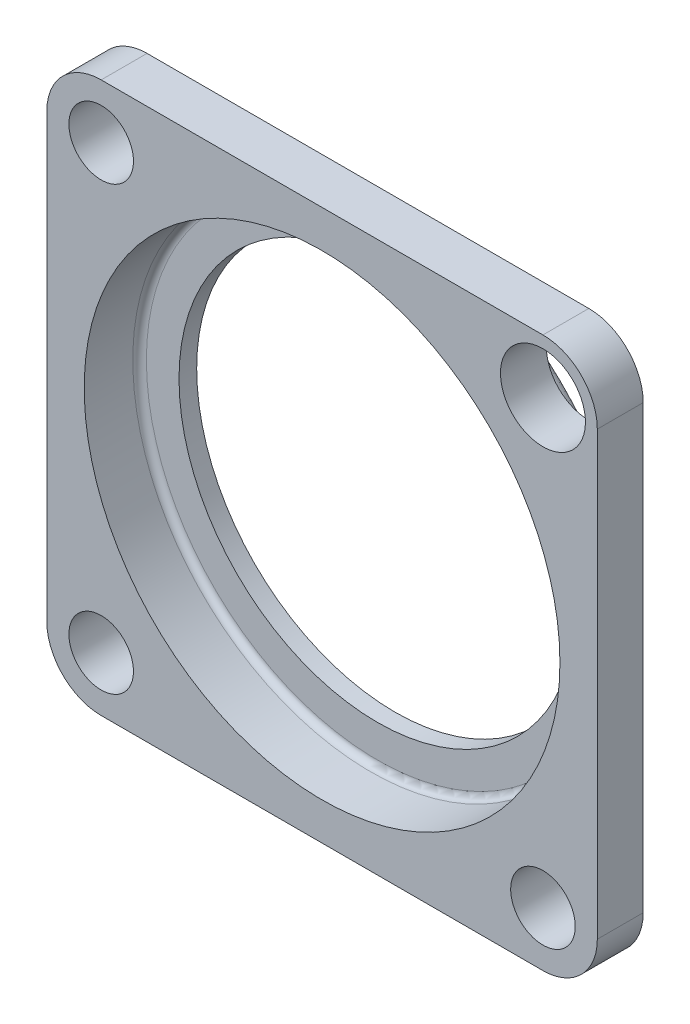
ISO-10303-21;
HEADER;
FILE_DESCRIPTION(('STEP AP214'),'2;1');
FILE_NAME('part.step','',(''),(''),'','','');
FILE_SCHEMA(('AUTOMOTIVE_DESIGN { 1 0 10303 214 1 1 1 1 }'));
ENDSEC;
DATA;
#1=APPLICATION_CONTEXT('core data for automotive mechanical design processes');
#2=APPLICATION_PROTOCOL_DEFINITION('international standard','automotive_design',2000,#1);
#3=PRODUCT_CONTEXT('',#1,'mechanical');
#4=PRODUCT('Part','Part','',(#3));
#5=PRODUCT_RELATED_PRODUCT_CATEGORY('part','',(#4));
#6=PRODUCT_DEFINITION_FORMATION('','',#4);
#7=PRODUCT_DEFINITION_CONTEXT('part definition',#1,'design');
#8=PRODUCT_DEFINITION('design','',#6,#7);
#9=PRODUCT_DEFINITION_SHAPE('','',#8);
#10=(LENGTH_UNIT() NAMED_UNIT(*) SI_UNIT(.MILLI.,.METRE.));
#11=(NAMED_UNIT(*) PLANE_ANGLE_UNIT() SI_UNIT($,.RADIAN.));
#12=(NAMED_UNIT(*) SI_UNIT($,.STERADIAN.) SOLID_ANGLE_UNIT());
#13=UNCERTAINTY_MEASURE_WITH_UNIT(LENGTH_MEASURE(1.E-05),#10,'distance_accuracy_value','');
#14=(GEOMETRIC_REPRESENTATION_CONTEXT(3) GLOBAL_UNCERTAINTY_ASSIGNED_CONTEXT((#13)) GLOBAL_UNIT_ASSIGNED_CONTEXT((#10,
#11,#12)) REPRESENTATION_CONTEXT('',''));
#15=CARTESIAN_POINT('',(0.,0.,0.));
#16=DIRECTION('',(0.,0.,1.));
#17=DIRECTION('',(1.,0.,0.));
#18=AXIS2_PLACEMENT_3D('',#15,#16,#17);
#19=CARTESIAN_POINT('',(-0.00259371394449204,0.00320343713926974,-389.399623049439));
#20=DIRECTION('',(0.,0.,-1.));
#21=DIRECTION('',(0.,-1.,0.));
#22=AXIS2_PLACEMENT_3D('',#19,#20,#21);
#23=PLANE('',#22);
#24=CARTESIAN_POINT('',(0.,0.,-389.399623049439));
#25=DIRECTION('',(0.,0.,-1.));
#26=DIRECTION('',(-1.,0.,0.));
#27=AXIS2_PLACEMENT_3D('',#24,#25,#26);
#28=CIRCLE('',#27,70.);
#29=CARTESIAN_POINT('',(70.,0.,-389.399623049439));
#30=VERTEX_POINT('',#29);
#31=EDGE_CURVE('E201',#30,#30,#28,.T.);
#32=ORIENTED_EDGE('',*,*,#31,.T.);
#33=EDGE_LOOP('',(#32));
#34=FACE_BOUND('',#33,.T.);
#35=CARTESIAN_POINT('',(64.9980541664548,-64.9961486760095,-389.399623049447));
#36=DIRECTION('',(-1.27309946439277E-13,0.,-1.));
#37=DIRECTION('',(9.96744036330944E-06,-0.999999999950325,0.));
#38=AXIS2_PLACEMENT_3D('',#35,#36,#37);
#39=CIRCLE('',#38,9.5);
#40=CARTESIAN_POINT('',(64.9979594757696,-55.4961486764813,-389.399623049446));
#41=VERTEX_POINT('',#40);
#42=EDGE_CURVE('E263',#41,#41,#39,.T.);
#43=ORIENTED_EDGE('',*,*,#42,.T.);
#44=EDGE_LOOP('',(#43));
#45=FACE_BOUND('',#44,.T.);
#46=CARTESIAN_POINT('',(-65.0019458270874,-64.9974444432576,-389.399623049431));
#47=DIRECTION('',(-1.27309946439277E-13,0.,-1.));
#48=DIRECTION('',(9.96744036330944E-06,-0.999999999950325,0.));
#49=AXIS2_PLACEMENT_3D('',#46,#47,#48);
#50=CIRCLE('',#49,9.5);
#51=CARTESIAN_POINT('',(-65.0020405177726,-55.4974444437295,-389.39962304943));
#52=VERTEX_POINT('',#51);
#53=EDGE_CURVE('E252',#52,#52,#50,.T.);
#54=ORIENTED_EDGE('',*,*,#53,.T.);
#55=EDGE_LOOP('',(#54));
#56=FACE_BOUND('',#55,.T.);
#57=CARTESIAN_POINT('',(-65.0032415943344,65.0025555502847,-389.399623049429));
#58=DIRECTION('',(-1.27309946439277E-13,0.,-1.));
#59=DIRECTION('',(9.96744036330944E-06,-0.999999999950325,0.));
#60=AXIS2_PLACEMENT_3D('',#57,#58,#59);
#61=CIRCLE('',#60,9.5);
#62=CARTESIAN_POINT('',(-65.0033362850196,74.5025555498128,-389.399623049429));
#63=VERTEX_POINT('',#62);
#64=EDGE_CURVE('E239',#63,#63,#61,.T.);
#65=ORIENTED_EDGE('',*,*,#64,.T.);
#66=EDGE_LOOP('',(#65));
#67=FACE_BOUND('',#66,.T.);
#68=CARTESIAN_POINT('',(64.9967583992076,65.0038513175325,-389.399623049447));
#69=DIRECTION('',(-1.27309946439219E-13,0.,-1.));
#70=DIRECTION('',(9.96744036336768E-06,-0.999999999950325,0.));
#71=AXIS2_PLACEMENT_3D('',#68,#69,#70);
#72=CIRCLE('',#71,12.5);
#73=CARTESIAN_POINT('',(64.9966338062013,77.5038513169116,-389.399623049446));
#74=VERTEX_POINT('',#73);
#75=EDGE_CURVE('E193',#74,#74,#72,.T.);
#76=ORIENTED_EDGE('',*,*,#75,.T.);
#77=EDGE_LOOP('',(#76));
#78=FACE_BOUND('',#77,.T.);
#79=DIRECTION('',(9.96744036217376E-06,-0.999999999950325,0.));
#80=VECTOR('',#79,1.);
#81=CARTESIAN_POINT('',(-81.0019458262971,-64.9976039223009,-389.399623049439));
#82=LINE('',#81,#80);
#83=CARTESIAN_POINT('',(-81.0032415935442,65.0023960712406,-389.399623049439));
#84=VERTEX_POINT('',#83);
#85=CARTESIAN_POINT('',(-81.0019458262971,-64.9976039223009,-389.399623049439));
#86=VERTEX_POINT('',#85);
#87=EDGE_CURVE('E11',#84,#86,#82,.T.);
#88=ORIENTED_EDGE('',*,*,#87,.T.);
#89=CARTESIAN_POINT('',(-65.0019458270918,-64.9974444432564,-389.399623049439));
#90=DIRECTION('',(0.,0.,1.));
#91=DIRECTION('',(0.662435719443942,-0.749118760681367,0.));
#92=AXIS2_PLACEMENT_3D('',#89,#90,#91);
#93=CIRCLE('',#92,15.9999999999982);
#94=CARTESIAN_POINT('',(-65.0017863480461,-80.9974444424598,-389.399623049439));
#95=VERTEX_POINT('',#94);
#96=EDGE_CURVE('E338',#86,#95,#93,.T.);
#97=ORIENTED_EDGE('',*,*,#96,.T.);
#98=DIRECTION('',(0.999999999950325,9.96744035930419E-06,0.));
#99=VECTOR('',#98,1.);
#100=CARTESIAN_POINT('',(64.9982136454962,-80.9961486752138,-389.399623049439));
#101=LINE('',#100,#99);
#102=CARTESIAN_POINT('',(64.9982136454962,-80.9961486752138,-389.399623049439));
#103=VERTEX_POINT('',#102);
#104=EDGE_CURVE('E318',#95,#103,#101,.T.);
#105=ORIENTED_EDGE('',*,*,#104,.T.);
#106=CARTESIAN_POINT('',(64.9980541664502,-64.9961486760083,-389.399623049439));
#107=DIRECTION('',(0.,0.,1.));
#108=DIRECTION('',(0.999999999950325,9.96744036863008E-06,0.));
#109=AXIS2_PLACEMENT_3D('',#106,#107,#108);
#110=CIRCLE('',#109,16.);
#111=CARTESIAN_POINT('',(80.9980541656554,-64.9959891969624,-389.399623049439));
#112=VERTEX_POINT('',#111);
#113=EDGE_CURVE('E319',#103,#112,#110,.T.);
#114=ORIENTED_EDGE('',*,*,#113,.T.);
#115=DIRECTION('',(-9.96744036217369E-06,0.999999999950325,0.));
#116=VECTOR('',#115,1.);
#117=CARTESIAN_POINT('',(80.9967583984083,65.0040107965791,-389.399623049439));
#118=LINE('',#117,#116);
#119=CARTESIAN_POINT('',(80.9967583984083,65.0040107965791,-389.399623049439));
#120=VERTEX_POINT('',#119);
#121=EDGE_CURVE('E219',#112,#120,#118,.T.);
#122=ORIENTED_EDGE('',*,*,#121,.T.);
#123=CARTESIAN_POINT('',(64.996758399203,65.0038513175332,-389.399623049439));
#124=DIRECTION('',(0.,0.,1.));
#125=DIRECTION('',(-9.96744036585451E-06,0.999999999950325,0.));
#126=AXIS2_PLACEMENT_3D('',#123,#124,#125);
#127=CIRCLE('',#126,16.);
#128=CARTESIAN_POINT('',(64.9965989201572,81.0038513167384,-389.399623049439));
#129=VERTEX_POINT('',#128);
#130=EDGE_CURVE('E245',#120,#129,#127,.T.);
#131=ORIENTED_EDGE('',*,*,#130,.T.);
#132=DIRECTION('',(-0.999999999950325,-9.9674403614905E-06,0.));
#133=VECTOR('',#132,1.);
#134=CARTESIAN_POINT('',(-65.0034010733849,81.0025555494914,-389.399623049439));
#135=LINE('',#134,#133);
#136=CARTESIAN_POINT('',(-65.003401073385,81.0025555494911,-389.399623049439));
#137=VERTEX_POINT('',#136);
#138=EDGE_CURVE('E293',#129,#137,#135,.T.);
#139=ORIENTED_EDGE('',*,*,#138,.T.);
#140=CARTESIAN_POINT('',(-65.0032415943392,65.0025555502859,-389.399623049439));
#141=DIRECTION('',(0.,0.,1.));
#142=DIRECTION('',(-0.999999999950325,-9.96744036196874E-06,0.));
#143=AXIS2_PLACEMENT_3D('',#140,#141,#142);
#144=CIRCLE('',#143,16.);
#145=EDGE_CURVE('E277',#137,#84,#144,.T.);
#146=ORIENTED_EDGE('',*,*,#145,.T.);
#147=EDGE_LOOP('',(#88,#97,#105,#114,#122,#131,#139,#146));
#148=FACE_BOUND('',#147,.T.);
#149=ADVANCED_FACE('F17',(#34,#45,#56,#67,#78,#148),#23,.F.);
#150=CARTESIAN_POINT('',(-0.00259371394449204,0.00320343713926974,-402.899623049439));
#151=DIRECTION('',(0.,0.,-1.));
#152=DIRECTION('',(0.,-1.,0.));
#153=AXIS2_PLACEMENT_3D('',#150,#151,#152);
#154=PLANE('',#153);
#155=CARTESIAN_POINT('',(64.9980541664513,-64.9961486760094,-402.899623049447));
#156=DIRECTION('',(-1.27309946439277E-13,0.,-1.));
#157=DIRECTION('',(9.96744036330944E-06,-0.999999999950325,0.));
#158=AXIS2_PLACEMENT_3D('',#155,#156,#157);
#159=CIRCLE('',#158,9.5);
#160=CARTESIAN_POINT('',(64.9979594757679,-55.4961486764813,-402.899623049447));
#161=VERTEX_POINT('',#160);
#162=EDGE_CURVE('E271',#161,#161,#159,.T.);
#163=ORIENTED_EDGE('',*,*,#162,.F.);
#164=EDGE_LOOP('',(#163));
#165=FACE_BOUND('',#164,.T.);
#166=CARTESIAN_POINT('',(-65.0019458270909,-64.9974444432576,-402.899623049431));
#167=DIRECTION('',(-1.27309946439277E-13,0.,-1.));
#168=DIRECTION('',(9.96744036330944E-06,-0.999999999950325,0.));
#169=AXIS2_PLACEMENT_3D('',#166,#167,#168);
#170=CIRCLE('',#169,9.5);
#171=CARTESIAN_POINT('',(-65.0020405177743,-55.4974444437295,-402.899623049431));
#172=VERTEX_POINT('',#171);
#173=EDGE_CURVE('E260',#172,#172,#170,.T.);
#174=ORIENTED_EDGE('',*,*,#173,.F.);
#175=EDGE_LOOP('',(#174));
#176=FACE_BOUND('',#175,.T.);
#177=CARTESIAN_POINT('',(-65.0032415943379,65.0025555502847,-402.899623049429));
#178=DIRECTION('',(-1.27309946439277E-13,0.,-1.));
#179=DIRECTION('',(9.96744036330944E-06,-0.999999999950325,0.));
#180=AXIS2_PLACEMENT_3D('',#177,#178,#179);
#181=CIRCLE('',#180,9.5);
#182=CARTESIAN_POINT('',(-65.0033362850213,74.5025555498128,-402.899623049429));
#183=VERTEX_POINT('',#182);
#184=EDGE_CURVE('E244',#183,#183,#181,.T.);
#185=ORIENTED_EDGE('',*,*,#184,.F.);
#186=EDGE_LOOP('',(#185));
#187=FACE_BOUND('',#186,.T.);
#188=CARTESIAN_POINT('',(64.9967583992041,65.0038513175326,-402.899623049447));
#189=DIRECTION('',(1.27309946439219E-13,0.,1.));
#190=DIRECTION('',(9.96744036336768E-06,-0.999999999950325,0.));
#191=AXIS2_PLACEMENT_3D('',#188,#189,#190);
#192=CIRCLE('',#191,12.5);
#193=CARTESIAN_POINT('',(64.9966338061996,77.5038513169117,-402.899623049447));
#194=VERTEX_POINT('',#193);
#195=EDGE_CURVE('E236',#194,#194,#192,.T.);
#196=ORIENTED_EDGE('',*,*,#195,.T.);
#197=EDGE_LOOP('',(#196));
#198=FACE_BOUND('',#197,.T.);
#199=CARTESIAN_POINT('',(0.,0.,-402.899623049439));
#200=DIRECTION('',(0.,0.,1.));
#201=DIRECTION('',(0.,1.,0.));
#202=AXIS2_PLACEMENT_3D('',#199,#200,#201);
#203=CIRCLE('',#202,72.0027639147435);
#204=CARTESIAN_POINT('',(0.,-72.0027639147435,-402.899623049439));
#205=VERTEX_POINT('',#204);
#206=EDGE_CURVE('E210',#205,#205,#203,.T.);
#207=ORIENTED_EDGE('',*,*,#206,.T.);
#208=EDGE_LOOP('',(#207));
#209=FACE_BOUND('',#208,.T.);
#210=DIRECTION('',(-9.96744036217376E-06,0.999999999950325,0.));
#211=VECTOR('',#210,1.);
#212=CARTESIAN_POINT('',(-81.0019458262971,-64.9976039223009,-402.899623049439));
#213=LINE('',#212,#211);
#214=CARTESIAN_POINT('',(-81.0019458262971,-64.9976039223009,-402.899623049439));
#215=VERTEX_POINT('',#214);
#216=CARTESIAN_POINT('',(-81.0032415935442,65.0023960712406,-402.899623049439));
#217=VERTEX_POINT('',#216);
#218=EDGE_CURVE('E26',#215,#217,#213,.T.);
#219=ORIENTED_EDGE('',*,*,#218,.T.);
#220=CARTESIAN_POINT('',(-65.0032415943392,65.0025555502859,-402.899623049439));
#221=DIRECTION('',(0.,0.,-1.));
#222=DIRECTION('',(-0.999999999950325,-9.96744036196874E-06,0.));
#223=AXIS2_PLACEMENT_3D('',#220,#221,#222);
#224=CIRCLE('',#223,16.);
#225=CARTESIAN_POINT('',(-65.003401073385,81.0025555494911,-402.899623049439));
#226=VERTEX_POINT('',#225);
#227=EDGE_CURVE('E280',#217,#226,#224,.T.);
#228=ORIENTED_EDGE('',*,*,#227,.T.);
#229=DIRECTION('',(0.999999999950325,9.9674403614905E-06,0.));
#230=VECTOR('',#229,1.);
#231=CARTESIAN_POINT('',(-65.0034010733849,81.0025555494914,-402.899623049439));
#232=LINE('',#231,#230);
#233=CARTESIAN_POINT('',(64.9965989201572,81.0038513167384,-402.899623049439));
#234=VERTEX_POINT('',#233);
#235=EDGE_CURVE('E276',#226,#234,#232,.T.);
#236=ORIENTED_EDGE('',*,*,#235,.T.);
#237=CARTESIAN_POINT('',(64.996758399203,65.0038513175332,-402.899623049439));
#238=DIRECTION('',(0.,0.,-1.));
#239=DIRECTION('',(-9.96744036585451E-06,0.999999999950325,0.));
#240=AXIS2_PLACEMENT_3D('',#237,#238,#239);
#241=CIRCLE('',#240,16.);
#242=CARTESIAN_POINT('',(80.9967583984083,65.0040107965791,-402.899623049439));
#243=VERTEX_POINT('',#242);
#244=EDGE_CURVE('E249',#234,#243,#241,.T.);
#245=ORIENTED_EDGE('',*,*,#244,.T.);
#246=DIRECTION('',(9.96744036217369E-06,-0.999999999950325,0.));
#247=VECTOR('',#246,1.);
#248=CARTESIAN_POINT('',(80.9967583984083,65.0040107965791,-402.899623049439));
#249=LINE('',#248,#247);
#250=CARTESIAN_POINT('',(80.9980541656554,-64.9959891969624,-402.899623049439));
#251=VERTEX_POINT('',#250);
#252=EDGE_CURVE('E223',#243,#251,#249,.T.);
#253=ORIENTED_EDGE('',*,*,#252,.T.);
#254=CARTESIAN_POINT('',(64.9980541664502,-64.9961486760083,-402.899623049439));
#255=DIRECTION('',(0.,0.,-1.));
#256=DIRECTION('',(0.999999999950325,9.96744036863008E-06,0.));
#257=AXIS2_PLACEMENT_3D('',#254,#255,#256);
#258=CIRCLE('',#257,16.);
#259=CARTESIAN_POINT('',(64.9982136454962,-80.9961486752138,-402.899623049439));
#260=VERTEX_POINT('',#259);
#261=EDGE_CURVE('E312',#251,#260,#258,.T.);
#262=ORIENTED_EDGE('',*,*,#261,.T.);
#263=DIRECTION('',(-0.999999999950325,-9.96744035930419E-06,0.));
#264=VECTOR('',#263,1.);
#265=CARTESIAN_POINT('',(64.9982136454962,-80.9961486752138,-402.899623049439));
#266=LINE('',#265,#264);
#267=CARTESIAN_POINT('',(-65.0017863480462,-80.9974444424598,-402.899623049439));
#268=VERTEX_POINT('',#267);
#269=EDGE_CURVE('E329',#260,#268,#266,.T.);
#270=ORIENTED_EDGE('',*,*,#269,.T.);
#271=CARTESIAN_POINT('',(-65.0019458270918,-64.9974444432564,-402.899623049439));
#272=DIRECTION('',(0.,0.,-1.));
#273=DIRECTION('',(0.662435719443942,-0.749118760681367,0.));
#274=AXIS2_PLACEMENT_3D('',#271,#272,#273);
#275=CIRCLE('',#274,15.9999999999982);
#276=EDGE_CURVE('E317',#268,#215,#275,.T.);
#277=ORIENTED_EDGE('',*,*,#276,.T.);
#278=EDGE_LOOP('',(#219,#228,#236,#245,#253,#262,#270,#277));
#279=FACE_BOUND('',#278,.T.);
#280=ADVANCED_FACE('F19',(#165,#176,#187,#198,#209,#279),#154,.T.);
#281=CARTESIAN_POINT('',(-81.0032415935442,65.0023960712406,-402.899623049439));
#282=DIRECTION('',(-0.999999999950325,-9.96744036217376E-06,0.));
#283=DIRECTION('',(-9.96744036217376E-06,0.999999999950325,0.));
#284=AXIS2_PLACEMENT_3D('',#281,#282,#283);
#285=PLANE('',#284);
#286=ORIENTED_EDGE('',*,*,#218,.F.);
#287=DIRECTION('',(0.,0.,1.));
#288=VECTOR('',#287,1.);
#289=CARTESIAN_POINT('',(-81.0019458262971,-64.9976039223009,-402.899623049439));
#290=LINE('',#289,#288);
#291=EDGE_CURVE('E341',#215,#86,#290,.T.);
#292=ORIENTED_EDGE('',*,*,#291,.T.);
#293=ORIENTED_EDGE('',*,*,#87,.F.);
#294=DIRECTION('',(0.,0.,1.));
#295=VECTOR('',#294,1.);
#296=CARTESIAN_POINT('',(-81.0032415935442,65.0023960712406,-402.899623049439));
#297=LINE('',#296,#295);
#298=EDGE_CURVE('E284',#217,#84,#297,.T.);
#299=ORIENTED_EDGE('',*,*,#298,.F.);
#300=EDGE_LOOP('',(#286,#292,#293,#299));
#301=FACE_BOUND('',#300,.T.);
#302=ADVANCED_FACE('F347',(#301),#285,.T.);
#303=CARTESIAN_POINT('',(-65.0019458270918,-64.9974444432564,-402.899623049439));
#304=DIRECTION('',(0.,0.,1.));
#305=DIRECTION('',(0.662435719443942,-0.749118760681367,0.));
#306=AXIS2_PLACEMENT_3D('',#303,#304,#305);
#307=CYLINDRICAL_SURFACE('',#306,15.9999999999982);
#308=ORIENTED_EDGE('',*,*,#276,.F.);
#309=DIRECTION('',(0.,0.,1.));
#310=VECTOR('',#309,1.);
#311=CARTESIAN_POINT('',(-65.0017863480462,-80.9974444424598,-402.899623049439));
#312=LINE('',#311,#310);
#313=EDGE_CURVE('E313',#268,#95,#312,.T.);
#314=ORIENTED_EDGE('',*,*,#313,.T.);
#315=ORIENTED_EDGE('',*,*,#96,.F.);
#316=ORIENTED_EDGE('',*,*,#291,.F.);
#317=EDGE_LOOP('',(#308,#314,#315,#316));
#318=FACE_BOUND('',#317,.T.);
#319=ADVANCED_FACE('F374',(#318),#307,.T.);
#320=CARTESIAN_POINT('',(-65.0017863480461,-80.9974444424605,-402.899623049439));
#321=DIRECTION('',(9.96744035930419E-06,-0.999999999950325,0.));
#322=DIRECTION('',(0.,0.,-1.));
#323=AXIS2_PLACEMENT_3D('',#320,#321,#322);
#324=PLANE('',#323);
#325=ORIENTED_EDGE('',*,*,#269,.F.);
#326=DIRECTION('',(0.,0.,1.));
#327=VECTOR('',#326,1.);
#328=CARTESIAN_POINT('',(64.9982136454962,-80.9961486752138,-402.899623049439));
#329=LINE('',#328,#327);
#330=EDGE_CURVE('E322',#260,#103,#329,.T.);
#331=ORIENTED_EDGE('',*,*,#330,.T.);
#332=ORIENTED_EDGE('',*,*,#104,.F.);
#333=ORIENTED_EDGE('',*,*,#313,.F.);
#334=EDGE_LOOP('',(#325,#331,#332,#333));
#335=FACE_BOUND('',#334,.T.);
#336=ADVANCED_FACE('F370',(#335),#324,.T.);
#337=CARTESIAN_POINT('',(64.9980541664502,-64.9961486760083,-402.899623049439));
#338=DIRECTION('',(0.,0.,1.));
#339=DIRECTION('',(0.999999999950325,9.96744036863008E-06,0.));
#340=AXIS2_PLACEMENT_3D('',#337,#338,#339);
#341=CYLINDRICAL_SURFACE('',#340,16.);
#342=ORIENTED_EDGE('',*,*,#261,.F.);
#343=DIRECTION('',(0.,0.,1.));
#344=VECTOR('',#343,1.);
#345=CARTESIAN_POINT('',(80.9980541656554,-64.9959891969624,-402.899623049439));
#346=LINE('',#345,#344);
#347=EDGE_CURVE('E222',#251,#112,#346,.T.);
#348=ORIENTED_EDGE('',*,*,#347,.T.);
#349=ORIENTED_EDGE('',*,*,#113,.F.);
#350=ORIENTED_EDGE('',*,*,#330,.F.);
#351=EDGE_LOOP('',(#342,#348,#349,#350));
#352=FACE_BOUND('',#351,.T.);
#353=ADVANCED_FACE('F366',(#352),#341,.T.);
#354=CARTESIAN_POINT('',(80.9980541656554,-64.9959891969624,-402.899623049439));
#355=DIRECTION('',(0.999999999950325,9.96744036217369E-06,0.));
#356=DIRECTION('',(0.,0.,-1.));
#357=AXIS2_PLACEMENT_3D('',#354,#355,#356);
#358=PLANE('',#357);
#359=ORIENTED_EDGE('',*,*,#252,.F.);
#360=DIRECTION('',(0.,0.,1.));
#361=VECTOR('',#360,1.);
#362=CARTESIAN_POINT('',(80.9967583984083,65.0040107965791,-402.899623049439));
#363=LINE('',#362,#361);
#364=EDGE_CURVE('E248',#243,#120,#363,.T.);
#365=ORIENTED_EDGE('',*,*,#364,.T.);
#366=ORIENTED_EDGE('',*,*,#121,.F.);
#367=ORIENTED_EDGE('',*,*,#347,.F.);
#368=EDGE_LOOP('',(#359,#365,#366,#367));
#369=FACE_BOUND('',#368,.T.);
#370=ADVANCED_FACE('F362',(#369),#358,.T.);
#371=CARTESIAN_POINT('',(64.996758399203,65.0038513175332,-402.899623049439));
#372=DIRECTION('',(0.,0.,1.));
#373=DIRECTION('',(-9.96744036585451E-06,0.999999999950325,0.));
#374=AXIS2_PLACEMENT_3D('',#371,#372,#373);
#375=CYLINDRICAL_SURFACE('',#374,16.);
#376=ORIENTED_EDGE('',*,*,#244,.F.);
#377=DIRECTION('',(0.,0.,1.));
#378=VECTOR('',#377,1.);
#379=CARTESIAN_POINT('',(64.9965989201572,81.0038513167384,-402.899623049439));
#380=LINE('',#379,#378);
#381=EDGE_CURVE('E296',#234,#129,#380,.T.);
#382=ORIENTED_EDGE('',*,*,#381,.T.);
#383=ORIENTED_EDGE('',*,*,#130,.F.);
#384=ORIENTED_EDGE('',*,*,#364,.F.);
#385=EDGE_LOOP('',(#376,#382,#383,#384));
#386=FACE_BOUND('',#385,.T.);
#387=ADVANCED_FACE('F358',(#386),#375,.T.);
#388=CARTESIAN_POINT('',(64.9965989201572,81.0038513167384,-402.899623049439));
#389=DIRECTION('',(-9.9674403614905E-06,0.999999999950325,0.));
#390=DIRECTION('',(0.,0.,1.));
#391=AXIS2_PLACEMENT_3D('',#388,#389,#390);
#392=PLANE('',#391);
#393=ORIENTED_EDGE('',*,*,#235,.F.);
#394=DIRECTION('',(0.,0.,1.));
#395=VECTOR('',#394,1.);
#396=CARTESIAN_POINT('',(-65.003401073385,81.0025555494911,-402.899623049439));
#397=LINE('',#396,#395);
#398=EDGE_CURVE('E272',#226,#137,#397,.T.);
#399=ORIENTED_EDGE('',*,*,#398,.T.);
#400=ORIENTED_EDGE('',*,*,#138,.F.);
#401=ORIENTED_EDGE('',*,*,#381,.F.);
#402=EDGE_LOOP('',(#393,#399,#400,#401));
#403=FACE_BOUND('',#402,.T.);
#404=ADVANCED_FACE('F354',(#403),#392,.T.);
#405=CARTESIAN_POINT('',(-65.0032415943392,65.0025555502859,-402.899623049439));
#406=DIRECTION('',(0.,0.,1.));
#407=DIRECTION('',(-0.999999999950325,-9.96744036196874E-06,0.));
#408=AXIS2_PLACEMENT_3D('',#405,#406,#407);
#409=CYLINDRICAL_SURFACE('',#408,16.);
#410=ORIENTED_EDGE('',*,*,#227,.F.);
#411=ORIENTED_EDGE('',*,*,#298,.T.);
#412=ORIENTED_EDGE('',*,*,#145,.F.);
#413=ORIENTED_EDGE('',*,*,#398,.F.);
#414=EDGE_LOOP('',(#410,#411,#412,#413));
#415=FACE_BOUND('',#414,.T.);
#416=ADVANCED_FACE('F351',(#415),#409,.T.);
#417=CARTESIAN_POINT('',(64.9980541664513,-64.9961486760094,-402.899623049447));
#418=DIRECTION('',(1.27305573490351E-13,0.,1.));
#419=DIRECTION('',(9.96744036330944E-06,-0.999999999950325,0.));
#420=AXIS2_PLACEMENT_3D('',#417,#418,#419);
#421=CYLINDRICAL_SURFACE('',#420,9.5);
#422=ORIENTED_EDGE('',*,*,#42,.F.);
#423=DIRECTION('',(-1.27305573490351E-13,0.,-1.));
#424=VECTOR('',#423,1.);
#425=CARTESIAN_POINT('',(64.9979594757679,-55.4961486764813,-402.899623049447));
#426=LINE('',#425,#424);
#427=EDGE_CURVE('E267',#41,#161,#426,.T.);
#428=ORIENTED_EDGE('',*,*,#427,.T.);
#429=ORIENTED_EDGE('',*,*,#162,.T.);
#430=ORIENTED_EDGE('',*,*,#427,.F.);
#431=EDGE_LOOP('',(#422,#428,#429,#430));
#432=FACE_BOUND('',#431,.T.);
#433=ADVANCED_FACE('F408',(#432),#421,.F.);
#434=CARTESIAN_POINT('',(-65.0019458270909,-64.9974444432576,-402.899623049431));
#435=DIRECTION('',(1.27305573490351E-13,0.,1.));
#436=DIRECTION('',(9.96744036330944E-06,-0.999999999950325,0.));
#437=AXIS2_PLACEMENT_3D('',#434,#435,#436);
#438=CYLINDRICAL_SURFACE('',#437,9.5);
#439=ORIENTED_EDGE('',*,*,#53,.F.);
#440=DIRECTION('',(-1.27305573490351E-13,0.,-1.));
#441=VECTOR('',#440,1.);
#442=CARTESIAN_POINT('',(-65.0020405177743,-55.4974444437295,-402.899623049431));
#443=LINE('',#442,#441);
#444=EDGE_CURVE('E256',#52,#172,#443,.T.);
#445=ORIENTED_EDGE('',*,*,#444,.T.);
#446=ORIENTED_EDGE('',*,*,#173,.T.);
#447=ORIENTED_EDGE('',*,*,#444,.F.);
#448=EDGE_LOOP('',(#439,#445,#446,#447));
#449=FACE_BOUND('',#448,.T.);
#450=ADVANCED_FACE('F402',(#449),#438,.F.);
#451=CARTESIAN_POINT('',(-65.0032415943379,65.0025555502847,-402.899623049429));
#452=DIRECTION('',(1.27305573490351E-13,0.,1.));
#453=DIRECTION('',(9.96744036330944E-06,-0.999999999950325,0.));
#454=AXIS2_PLACEMENT_3D('',#451,#452,#453);
#455=CYLINDRICAL_SURFACE('',#454,9.5);
#456=ORIENTED_EDGE('',*,*,#64,.F.);
#457=DIRECTION('',(-1.27305573490351E-13,0.,-1.));
#458=VECTOR('',#457,1.);
#459=CARTESIAN_POINT('',(-65.0033362850213,74.5025555498128,-402.899623049429));
#460=LINE('',#459,#458);
#461=EDGE_CURVE('E240',#63,#183,#460,.T.);
#462=ORIENTED_EDGE('',*,*,#461,.T.);
#463=ORIENTED_EDGE('',*,*,#184,.T.);
#464=ORIENTED_EDGE('',*,*,#461,.F.);
#465=EDGE_LOOP('',(#456,#462,#463,#464));
#466=FACE_BOUND('',#465,.T.);
#467=ADVANCED_FACE('F398',(#466),#455,.F.);
#468=CARTESIAN_POINT('',(64.9967583992041,65.0038513175326,-402.899623049447));
#469=DIRECTION('',(1.27305573490351E-13,0.,1.));
#470=DIRECTION('',(9.96744036336768E-06,-0.999999999950325,0.));
#471=AXIS2_PLACEMENT_3D('',#468,#469,#470);
#472=CYLINDRICAL_SURFACE('',#471,12.5);
#473=ORIENTED_EDGE('',*,*,#75,.F.);
#474=DIRECTION('',(-1.27305573490351E-13,0.,-1.));
#475=VECTOR('',#474,1.);
#476=CARTESIAN_POINT('',(64.9966338061996,77.5038513169117,-402.899623049446));
#477=LINE('',#476,#475);
#478=EDGE_CURVE('E197',#74,#194,#477,.T.);
#479=ORIENTED_EDGE('',*,*,#478,.T.);
#480=ORIENTED_EDGE('',*,*,#195,.F.);
#481=ORIENTED_EDGE('',*,*,#478,.F.);
#482=EDGE_LOOP('',(#473,#479,#480,#481));
#483=FACE_BOUND('',#482,.T.);
#484=ADVANCED_FACE('F394',(#483),#472,.F.);
#485=CARTESIAN_POINT('',(0.,0.,-408.299705261221));
#486=DIRECTION('',(0.,0.,-1.));
#487=DIRECTION('',(0.,1.,0.));
#488=AXIS2_PLACEMENT_3D('',#485,#486,#487);
#489=CYLINDRICAL_SURFACE('',#488,58.4);
#490=CARTESIAN_POINT('',(0.,0.,-410.899623049432));
#491=DIRECTION('',(0.,0.,-1.));
#492=DIRECTION('',(1.,0.,0.));
#493=AXIS2_PLACEMENT_3D('',#490,#491,#492);
#494=CIRCLE('',#493,58.4);
#495=CARTESIAN_POINT('',(0.,-58.4,-410.899623049432));
#496=VERTEX_POINT('',#495);
#497=EDGE_CURVE('E218',#496,#496,#494,.T.);
#498=ORIENTED_EDGE('',*,*,#497,.T.);
#499=DIRECTION('',(0.,0.,1.));
#500=VECTOR('',#499,1.);
#501=CARTESIAN_POINT('',(0.,-58.4,-408.299705261221));
#502=LINE('',#501,#500);
#503=CARTESIAN_POINT('',(0.,-58.4,-405.69978747301));
#504=VERTEX_POINT('',#503);
#505=EDGE_CURVE('E198',#496,#504,#502,.T.);
#506=ORIENTED_EDGE('',*,*,#505,.T.);
#507=CARTESIAN_POINT('',(0.,0.,-405.69978747301));
#508=DIRECTION('',(0.,0.,-1.));
#509=DIRECTION('',(1.,0.,0.));
#510=AXIS2_PLACEMENT_3D('',#507,#508,#509);
#511=CIRCLE('',#510,58.4);
#512=EDGE_CURVE('E183',#504,#504,#511,.T.);
#513=ORIENTED_EDGE('',*,*,#512,.F.);
#514=ORIENTED_EDGE('',*,*,#505,.F.);
#515=EDGE_LOOP('',(#498,#506,#513,#514));
#516=FACE_BOUND('',#515,.T.);
#517=ADVANCED_FACE('F390',(#516),#489,.F.);
#518=CARTESIAN_POINT('',(0.,58.4,-410.899623049432));
#519=DIRECTION('',(0.,0.,-1.));
#520=DIRECTION('',(0.,-1.,0.));
#521=AXIS2_PLACEMENT_3D('',#518,#519,#520);
#522=PLANE('',#521);
#523=ORIENTED_EDGE('',*,*,#497,.F.);
#524=EDGE_LOOP('',(#523));
#525=FACE_BOUND('',#524,.T.);
#526=CARTESIAN_POINT('',(0.,0.,-410.899623049433));
#527=DIRECTION('',(0.,0.,-1.));
#528=DIRECTION('',(1.,0.,0.));
#529=AXIS2_PLACEMENT_3D('',#526,#527,#528);
#530=CIRCLE('',#529,69.0027639148926);
#531=CARTESIAN_POINT('',(0.,69.0027639148926,-410.899623049433));
#532=VERTEX_POINT('',#531);
#533=EDGE_CURVE('E226',#532,#532,#530,.T.);
#534=ORIENTED_EDGE('',*,*,#533,.T.);
#535=EDGE_LOOP('',(#534));
#536=FACE_BOUND('',#535,.T.);
#537=ADVANCED_FACE('F393',(#525,#536),#522,.T.);
#538=CARTESIAN_POINT('',(0.,69.0027639148926,-410.899623049433));
#539=CARTESIAN_POINT('',(69.0027639148926,69.0027639148926,-410.899623049433));
#540=CARTESIAN_POINT('',(69.0027639148926,0.,-410.899623049433));
#541=CARTESIAN_POINT('',(69.0027639148926,-69.0027639148926,-410.899623049433));
#542=CARTESIAN_POINT('',(0.,-69.0027639148926,-410.899623049433));
#543=CARTESIAN_POINT('',(-69.0027639148926,-69.0027639148926,-410.899623049433));
#544=CARTESIAN_POINT('',(-69.0027639148926,0.,-410.899623049433));
#545=CARTESIAN_POINT('',(-69.0027639148926,69.0027639148926,-410.899623049433));
#546=CARTESIAN_POINT('',(0.,69.0027639148926,-410.899623049433));
#547=CARTESIAN_POINT('',(0.,72.0027639147442,-410.899623049433));
#548=CARTESIAN_POINT('',(72.0027639147441,72.0027639147441,-410.899623049433));
#549=CARTESIAN_POINT('',(72.0027639147442,0.,-410.899623049433));
#550=CARTESIAN_POINT('',(72.0027639147441,-72.0027639147441,-410.899623049433));
#551=CARTESIAN_POINT('',(0.,-72.0027639147442,-410.899623049433));
#552=CARTESIAN_POINT('',(-72.0027639147441,-72.0027639147441,-410.899623049433));
#553=CARTESIAN_POINT('',(-72.0027639147442,0.,-410.899623049433));
#554=CARTESIAN_POINT('',(-72.0027639147441,72.0027639147441,-410.899623049433));
#555=CARTESIAN_POINT('',(0.,72.0027639147442,-410.899623049433));
#556=CARTESIAN_POINT('',(0.,72.0027639147435,-407.899623049433));
#557=CARTESIAN_POINT('',(72.0027639147435,72.0027639147435,-407.899623049433));
#558=CARTESIAN_POINT('',(72.0027639147435,0.,-407.899623049433));
#559=CARTESIAN_POINT('',(72.0027639147435,-72.0027639147435,-407.899623049433));
#560=CARTESIAN_POINT('',(0.,-72.0027639147435,-407.899623049433));
#561=CARTESIAN_POINT('',(-72.0027639147435,-72.0027639147435,-407.899623049433));
#562=CARTESIAN_POINT('',(-72.0027639147435,0.,-407.899623049433));
#563=CARTESIAN_POINT('',(-72.0027639147435,72.0027639147435,-407.899623049433));
#564=CARTESIAN_POINT('',(0.,72.0027639147435,-407.899623049433));
#565=(BOUNDED_SURFACE() B_SPLINE_SURFACE(2,2,((#538,#539,#540,#541,#542,#543,#544,#545,#546),
(#547,#548,#549,#550,#551,#552,#553,#554,#555),(#556,#557,#558,#559,#560,#561,#562,#563,#564)),
.UNSPECIFIED.,.F.,.T.,.F.) B_SPLINE_SURFACE_WITH_KNOTS((3,3),(3,2,2,2,3),(0.,1.57079632679505),
(0.,1.5707963267949,3.14159265358979,4.71238898038469,6.28318530717959),
.UNSPECIFIED.) GEOMETRIC_REPRESENTATION_ITEM() RATIONAL_B_SPLINE_SURFACE(((1.,0.707106781186548,
1.,0.707106781186548,1.,0.707106781186548,1.,0.707106781186548,1.),(0.707106781186486,
0.499999999999957,0.707106781186486,0.499999999999957,0.707106781186486,0.499999999999957,
0.707106781186486,0.499999999999957,0.707106781186486),(1.,0.707106781186548,1.,
0.707106781186548,1.,0.707106781186548,1.,0.707106781186548,1.))) REPRESENTATION_ITEM('') SURFACE());
#566=CARTESIAN_POINT('',(0.,69.0027639148926,-407.899623049433));
#567=DIRECTION('',(1.,0.,0.));
#568=DIRECTION('',(0.,0.,-1.));
#569=AXIS2_PLACEMENT_3D('',#566,#567,#568);
#570=CIRCLE('',#569,3.);
#571=CARTESIAN_POINT('',(0.,72.0027639147435,-407.899623049432));
#572=VERTEX_POINT('',#571);
#573=EDGE_CURVE('E213',#532,#572,#570,.T.);
#574=CARTESIAN_POINT('',(0.,0.,-407.899623049432));
#575=DIRECTION('',(0.,0.,-1.));
#576=DIRECTION('',(1.,0.,0.));
#577=AXIS2_PLACEMENT_3D('',#574,#575,#576);
#578=CIRCLE('',#577,72.0027639147435);
#579=CARTESIAN_POINT('',(0.,-72.0027639147435,-407.899623049432));
#580=VERTEX_POINT('',#579);
#581=EDGE_CURVE('E192',#572,#580,#578,.T.);
#582=CARTESIAN_POINT('',(0.,0.,-407.899623049432));
#583=DIRECTION('',(0.,0.,-1.));
#584=DIRECTION('',(1.,0.,0.));
#585=AXIS2_PLACEMENT_3D('',#582,#583,#584);
#586=CIRCLE('',#585,72.0027639147435);
#587=EDGE_CURVE('E188',#580,#572,#586,.T.);
#588=ORIENTED_EDGE('',*,*,#573,.T.);
#589=ORIENTED_EDGE('',*,*,#581,.T.);
#590=ORIENTED_EDGE('',*,*,#587,.T.);
#591=ORIENTED_EDGE('',*,*,#573,.F.);
#592=ORIENTED_EDGE('',*,*,#533,.F.);
#593=EDGE_LOOP('',(#588,#589,#590,#591,#592));
#594=FACE_BOUND('',#593,.T.);
#595=ADVANCED_FACE('F386',(#594),#565,.T.);
#596=CARTESIAN_POINT('',(0.,0.,-405.399623049432));
#597=DIRECTION('',(0.,0.,-1.));
#598=DIRECTION('',(0.,1.,0.));
#599=AXIS2_PLACEMENT_3D('',#596,#597,#598);
#600=CYLINDRICAL_SURFACE('',#599,72.0027639147435);
#601=ORIENTED_EDGE('',*,*,#581,.F.);
#602=ORIENTED_EDGE('',*,*,#587,.F.);
#603=DIRECTION('',(0.,0.,1.));
#604=VECTOR('',#603,1.);
#605=CARTESIAN_POINT('',(0.,-72.0027639147435,-405.399623049432));
#606=LINE('',#605,#604);
#607=EDGE_CURVE('E191',#580,#205,#606,.T.);
#608=ORIENTED_EDGE('',*,*,#607,.T.);
#609=ORIENTED_EDGE('',*,*,#206,.F.);
#610=ORIENTED_EDGE('',*,*,#607,.F.);
#611=EDGE_LOOP('',(#601,#602,#608,#609,#610));
#612=FACE_BOUND('',#611,.T.);
#613=ADVANCED_FACE('F506',(#612),#600,.T.);
#614=CARTESIAN_POINT('',(0.,0.,-402.899623049439));
#615=DIRECTION('',(0.,0.,1.));
#616=DIRECTION('',(-1.,0.,0.));
#617=AXIS2_PLACEMENT_3D('',#614,#615,#616);
#618=CYLINDRICAL_SURFACE('',#617,70.);
#619=ORIENTED_EDGE('',*,*,#31,.F.);
#620=DIRECTION('',(0.,0.,-1.));
#621=VECTOR('',#620,1.);
#622=CARTESIAN_POINT('',(70.,0.,-402.899623049439));
#623=LINE('',#622,#621);
#624=CARTESIAN_POINT('',(70.,0.,-403.69978747301));
#625=VERTEX_POINT('',#624);
#626=EDGE_CURVE('E206',#30,#625,#623,.T.);
#627=ORIENTED_EDGE('',*,*,#626,.T.);
#628=CARTESIAN_POINT('',(0.,0.,-403.69978747301));
#629=DIRECTION('',(0.,0.,1.));
#630=DIRECTION('',(0.,-1.,0.));
#631=AXIS2_PLACEMENT_3D('',#628,#629,#630);
#632=CIRCLE('',#631,70.);
#633=EDGE_CURVE('E176',#625,#625,#632,.T.);
#634=ORIENTED_EDGE('',*,*,#633,.F.);
#635=ORIENTED_EDGE('',*,*,#626,.F.);
#636=EDGE_LOOP('',(#619,#627,#634,#635));
#637=FACE_BOUND('',#636,.T.);
#638=ADVANCED_FACE('F514',(#637),#618,.F.);
#639=CARTESIAN_POINT('',(0.,70.,-405.69978747301));
#640=DIRECTION('',(0.,0.,1.));
#641=DIRECTION('',(1.,0.,0.));
#642=AXIS2_PLACEMENT_3D('',#639,#640,#641);
#643=PLANE('',#642);
#644=ORIENTED_EDGE('',*,*,#512,.T.);
#645=EDGE_LOOP('',(#644));
#646=FACE_BOUND('',#645,.T.);
#647=CARTESIAN_POINT('',(0.,0.,-405.69978747301));
#648=DIRECTION('',(0.,0.,-1.));
#649=DIRECTION('',(0.,-1.,0.));
#650=AXIS2_PLACEMENT_3D('',#647,#648,#649);
#651=CIRCLE('',#650,68.);
#652=CARTESIAN_POINT('',(68.,0.,-405.69978747301));
#653=VERTEX_POINT('',#652);
#654=EDGE_CURVE('E174',#653,#653,#651,.T.);
#655=ORIENTED_EDGE('',*,*,#654,.F.);
#656=EDGE_LOOP('',(#655));
#657=FACE_BOUND('',#656,.T.);
#658=ADVANCED_FACE('F523',(#646,#657),#643,.T.);
#659=CARTESIAN_POINT('',(0.,0.,-403.69978747301));
#660=DIRECTION('',(0.,0.,-1.));
#661=DIRECTION('',(-1.,0.,0.));
#662=AXIS2_PLACEMENT_3D('',#659,#660,#661);
#663=TOROIDAL_SURFACE('',#662,68.,2.);
#664=ORIENTED_EDGE('',*,*,#654,.T.);
#665=CARTESIAN_POINT('',(68.,0.,-403.69978747301));
#666=DIRECTION('',(0.,-1.,0.));
#667=DIRECTION('',(1.,0.,0.));
#668=AXIS2_PLACEMENT_3D('',#665,#666,#667);
#669=CIRCLE('',#668,2.);
#670=EDGE_CURVE('E171',#653,#625,#669,.T.);
#671=ORIENTED_EDGE('',*,*,#670,.T.);
#672=ORIENTED_EDGE('',*,*,#633,.T.);
#673=ORIENTED_EDGE('',*,*,#670,.F.);
#674=EDGE_LOOP('',(#664,#671,#672,#673));
#675=FACE_BOUND('',#674,.T.);
#676=ADVANCED_FACE('F172',(#675),#663,.F.);
#677=CLOSED_SHELL('',(#149,#280,#302,#319,#336,#353,#370,#387,#404,#416,#433,#450,#467,#484,
#517,#537,#595,#613,#638,#658,#676));
#678=MANIFOLD_SOLID_BREP('B1',#677);
#679=ADVANCED_BREP_SHAPE_REPRESENTATION('',(#18,#678),#14);
#680=SHAPE_DEFINITION_REPRESENTATION(#9,#679);
ENDSEC;
END-ISO-10303-21;
